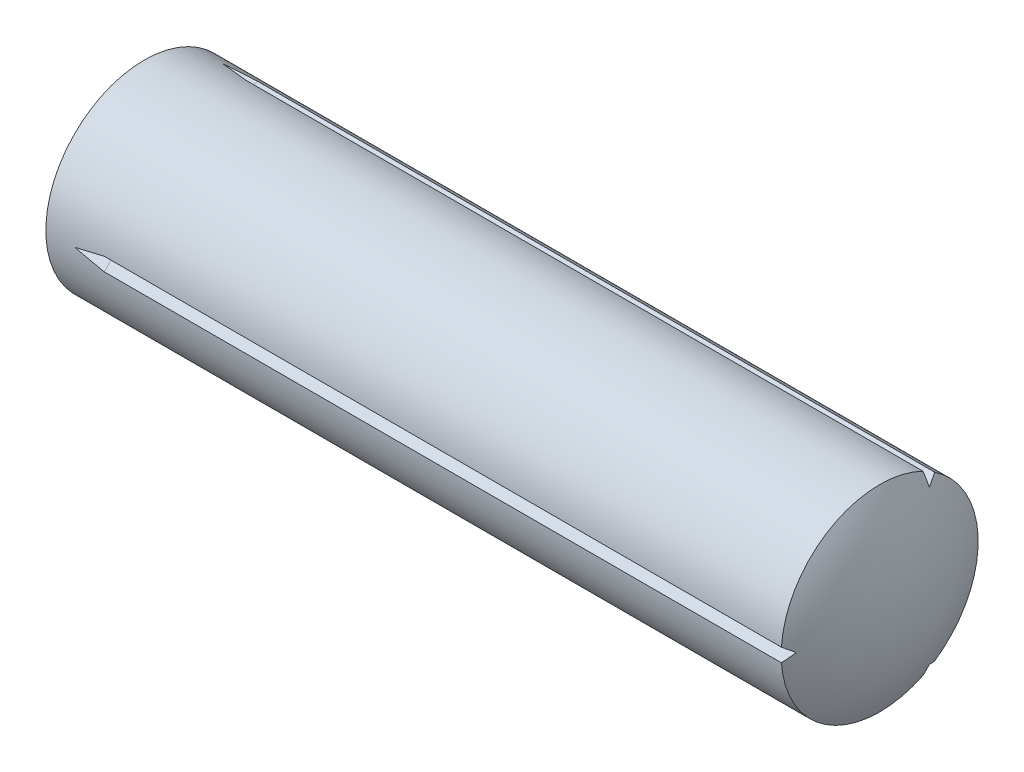
ISO-10303-21;
HEADER;
FILE_DESCRIPTION(('STEP AP214'),'2;1');
FILE_NAME('part.step','',(''),(''),'','','');
FILE_SCHEMA(('AUTOMOTIVE_DESIGN { 1 0 10303 214 1 1 1 1 }'));
ENDSEC;
DATA;
#1=APPLICATION_CONTEXT('core data for automotive mechanical design processes');
#2=APPLICATION_PROTOCOL_DEFINITION('international standard','automotive_design',2000,#1);
#3=PRODUCT_CONTEXT('',#1,'mechanical');
#4=PRODUCT('Part','Part','',(#3));
#5=PRODUCT_RELATED_PRODUCT_CATEGORY('part','',(#4));
#6=PRODUCT_DEFINITION_FORMATION('','',#4);
#7=PRODUCT_DEFINITION_CONTEXT('part definition',#1,'design');
#8=PRODUCT_DEFINITION('design','',#6,#7);
#9=PRODUCT_DEFINITION_SHAPE('','',#8);
#10=(LENGTH_UNIT() NAMED_UNIT(*) SI_UNIT(.MILLI.,.METRE.));
#11=(NAMED_UNIT(*) PLANE_ANGLE_UNIT() SI_UNIT($,.RADIAN.));
#12=(NAMED_UNIT(*) SI_UNIT($,.STERADIAN.) SOLID_ANGLE_UNIT());
#13=UNCERTAINTY_MEASURE_WITH_UNIT(LENGTH_MEASURE(1.E-05),#10,'distance_accuracy_value','');
#14=(GEOMETRIC_REPRESENTATION_CONTEXT(3) GLOBAL_UNCERTAINTY_ASSIGNED_CONTEXT((#13)) GLOBAL_UNIT_ASSIGNED_CONTEXT((#10,
#11,#12)) REPRESENTATION_CONTEXT('',''));
#15=CARTESIAN_POINT('',(0.,0.,0.));
#16=DIRECTION('',(0.,0.,1.));
#17=DIRECTION('',(1.,0.,0.));
#18=AXIS2_PLACEMENT_3D('',#15,#16,#17);
#19=CARTESIAN_POINT('',(-75.0312695557023,0.,0.));
#20=DIRECTION('',(-1.,0.,0.));
#21=DIRECTION('',(0.,1.,0.));
#22=AXIS2_PLACEMENT_3D('',#19,#20,#21);
#23=SPHERICAL_SURFACE('',#22,25.);
#24=CARTESIAN_POINT('',(-100.,0.,0.));
#25=DIRECTION('',(-1.,0.,0.));
#26=DIRECTION('',(0.,0.,1.));
#27=AXIS2_PLACEMENT_3D('',#24,#25,#26);
#28=CIRCLE('',#27,1.25);
#29=CARTESIAN_POINT('',(-100.,1.2500000000002,0.));
#30=VERTEX_POINT('',#29);
#31=EDGE_CURVE('E181',#30,#30,#28,.T.);
#32=CARTESIAN_POINT('',(-96.6819046503132,0.,0.));
#33=DIRECTION('',(-1.,0.,0.));
#34=DIRECTION('',(0.,0.,1.));
#35=AXIS2_PLACEMENT_3D('',#32,#33,#34);
#36=CIRCLE('',#35,12.5);
#37=CARTESIAN_POINT('',(-96.6819046503132,12.5,0.));
#38=VERTEX_POINT('',#37);
#39=EDGE_CURVE('E174',#38,#38,#36,.T.);
#40=CARTESIAN_POINT('',(-100.,1.2500000000002,0.));
#41=CARTESIAN_POINT('',(-99.9938336924778,1.37317333168658,0.));
#42=CARTESIAN_POINT('',(-99.9867558041352,1.49630102540896,0.));
#43=CARTESIAN_POINT('',(-99.9707787305738,1.74243819046354,0.));
#44=CARTESIAN_POINT('',(-99.9618795453548,1.86544766179574,0.));
#45=CARTESIAN_POINT('',(-99.942261742805,2.11132143560776,0.));
#46=CARTESIAN_POINT('',(-99.931543125474,2.23418573808758,0.));
#47=CARTESIAN_POINT('',(-99.9082888288313,2.47974226646478,0.));
#48=CARTESIAN_POINT('',(-99.8957531495195,2.60243449236216,0.));
#49=CARTESIAN_POINT('',(-99.8688674683718,2.84761999567285,0.));
#50=CARTESIAN_POINT('',(-99.854517466536,2.97011327308617,0.));
#51=CARTESIAN_POINT('',(-99.8240062848361,3.21487405159807,0.));
#52=CARTESIAN_POINT('',(-99.8078451049719,3.33714155269666,0.));
#53=CARTESIAN_POINT('',(-99.7737151063308,3.58142400006346,0.));
#54=CARTESIAN_POINT('',(-99.7557462875539,3.70343894633168,0.));
#55=CARTESIAN_POINT('',(-99.718004946655,3.94718956087136,0.));
#56=CARTESIAN_POINT('',(-99.698232424533,4.06892522914281,0.));
#57=CARTESIAN_POINT('',(-99.6568880074031,4.31209062567917,0.));
#58=CARTESIAN_POINT('',(-99.6353161123952,4.43352035394408,0.));
#59=CARTESIAN_POINT('',(-99.5903776740829,4.6760472754658,0.));
#60=CARTESIAN_POINT('',(-99.5670111307785,4.7971444687226,0.));
#61=CARTESIAN_POINT('',(-99.5184885135079,5.03897979805619,0.));
#62=CARTESIAN_POINT('',(-99.4933324395417,5.15971793413298,0.));
#63=CARTESIAN_POINT('',(-99.4412362705202,5.40080870557392,0.));
#64=CARTESIAN_POINT('',(-99.414296175465,5.52116134093807,0.));
#65=CARTESIAN_POINT('',(-99.3586378645657,5.76145475185175,0.));
#66=CARTESIAN_POINT('',(-99.3299196487216,5.88139552740127,0.));
#67=CARTESIAN_POINT('',(-99.2707113859815,6.12083894978741,0.));
#68=CARTESIAN_POINT('',(-99.2402213390854,6.24034159662403,0.));
#69=CARTESIAN_POINT('',(-99.1774760920364,6.47888258864311,0.));
#70=CARTESIAN_POINT('',(-99.1452208918834,6.59792093382557,0.));
#71=CARTESIAN_POINT('',(-99.078952402712,6.83550725128436,0.));
#72=CARTESIAN_POINT('',(-99.0449391136935,6.95405522356069,0.));
#73=CARTESIAN_POINT('',(-98.9751618962311,7.19063483135457,0.));
#74=CARTESIAN_POINT('',(-98.9393979677873,7.30866646687211,0.));
#75=CARTESIAN_POINT('',(-98.8661273043316,7.54418755038154,0.));
#76=CARTESIAN_POINT('',(-98.8286205693198,7.66167699837343,0.));
#77=CARTESIAN_POINT('',(-98.7518725072875,7.8960879748122,0.));
#78=CARTESIAN_POINT('',(-98.712631180267,8.01300950325909,0.));
#79=CARTESIAN_POINT('',(-98.6324225286792,8.24625903297173,0.));
#80=CARTESIAN_POINT('',(-98.5914552041119,8.36258703423749,0.));
#81=CARTESIAN_POINT('',(-98.5078035299129,8.59462403194343,0.));
#82=CARTESIAN_POINT('',(-98.4651191802811,8.71033302838361,0.));
#83=CARTESIAN_POINT('',(-98.3780428044906,8.94110667436576,0.));
#84=CARTESIAN_POINT('',(-98.3336507783319,9.05617132390772,0.));
#85=CARTESIAN_POINT('',(-98.2431687720324,9.28563107514242,0.));
#86=CARTESIAN_POINT('',(-98.1970787918916,9.40002617683515,0.));
#87=CARTESIAN_POINT('',(-98.1032109720534,9.62812177806317,0.));
#88=CARTESIAN_POINT('',(-98.055433132356,9.74182227759846,0.));
#89=CARTESIAN_POINT('',(-97.9582000574885,9.96850377232688,0.));
#90=CARTESIAN_POINT('',(-97.9087448223184,10.08148476752,0.));
#91=CARTESIAN_POINT('',(-97.8081677879997,10.3067025089814,0.));
#92=CARTESIAN_POINT('',(-97.7570459888512,10.4189392552497,0.));
#93=CARTESIAN_POINT('',(-97.6531470229441,10.6426439172087,0.));
#94=CARTESIAN_POINT('',(-97.6003698561855,10.7541118328994,0.));
#95=CARTESIAN_POINT('',(-97.4931717144603,10.9762544207054,0.));
#96=CARTESIAN_POINT('',(-97.4387507394937,11.0869290928207,0.));
#97=CARTESIAN_POINT('',(-97.3282768989746,11.307460953207,0.));
#98=CARTESIAN_POINT('',(-97.272224033422,11.417318141478,0.));
#99=CARTESIAN_POINT('',(-97.1584986934783,11.6361909766945,0.));
#100=CARTESIAN_POINT('',(-97.1008262190871,11.7452066236399,0.));
#101=CARTESIAN_POINT('',(-96.9838742728691,11.9623724890545,0.));
#102=CARTESIAN_POINT('',(-96.9245948010422,12.0705227075237,0.));
#103=CARTESIAN_POINT('',(-96.8044419168537,12.2859340705523,0.));
#104=CARTESIAN_POINT('',(-96.743568504492,12.3931952151119,0.));
#105=CARTESIAN_POINT('',(-96.6819046503132,12.5,0.));
#106=B_SPLINE_CURVE_WITH_KNOTS('',3,(#40,#41,#42,#43,#44,#45,#46,#47,#48,#49,#50,#51,#52,#53,
#54,#55,#56,#57,#58,#59,#60,#61,#62,#63,#64,#65,#66,#67,#68,#69,#70,#71,#72,#73,#74,#75,#76,#77,
#78,#79,#80,#81,#82,#83,#84,#85,#86,#87,#88,#89,#90,#91,#92,#93,#94,#95,#96,#97,#98,#99,#100,
#101,#102,#103,#104,#105),.UNSPECIFIED.,.F.,.F.,(4,2,2,2,2,2,2,2,2,2,2,2,2,2,2,2,2,2,2,2,2,2,2,
2,2,2,2,2,2,2,2,2,4),(0.,0.369979372671543,0.739958745343087,1.10993811801463,1.47991749068617,
1.84989686335772,2.21987623602926,2.5898556087008,2.95983498137235,3.32981435404389,
3.69979372671543,4.06977309938697,4.43975247205852,4.80973184473006,5.17971121740161,
5.54969059007315,5.91966996274469,6.28964933541624,6.65962870808778,7.02960808075932,
7.39958745343087,7.76956682610241,8.13954619877395,8.5095255714455,8.87950494411704,
9.24948431678859,9.61946368946012,9.98944306213167,10.3594224348032,10.7294018074747,
11.0993811801463,11.4693605528178,11.8393399254894),.UNSPECIFIED.);
#107=EDGE_CURVE('BSEAM35',#30,#38,#106,.T.);
#108=ORIENTED_EDGE('',*,*,#31,.F.);
#109=ORIENTED_EDGE('',*,*,#39,.T.);
#110=ORIENTED_EDGE('',*,*,#107,.T.);
#111=ORIENTED_EDGE('',*,*,#107,.F.);
#112=EDGE_LOOP('',(#108,#110,#109,#111));
#113=FACE_BOUND('',#112,.T.);
#114=ADVANCED_FACE('F35',(#113),#23,.T.);
#115=CARTESIAN_POINT('',(-100.,0.,0.));
#116=DIRECTION('',(1.,0.,0.));
#117=DIRECTION('',(0.,0.,-1.));
#118=AXIS2_PLACEMENT_3D('',#115,#116,#117);
#119=PLANE('',#118);
#120=ORIENTED_EDGE('',*,*,#31,.T.);
#121=EDGE_LOOP('',(#120));
#122=FACE_BOUND('',#121,.T.);
#123=ADVANCED_FACE('F240',(#122),#119,.F.);
#124=CARTESIAN_POINT('',(-25.,0.,0.));
#125=DIRECTION('',(-1.,0.,0.));
#126=DIRECTION('',(0.,1.,0.));
#127=AXIS2_PLACEMENT_3D('',#124,#125,#126);
#128=SPHERICAL_SURFACE('',#127,25.);
#129=CARTESIAN_POINT('',(-25.,5.84816389566394,2.72704361069372));
#130=DIRECTION('',(0.,-0.906307787036646,-0.422618261740707));
#131=DIRECTION('',(0.,0.422618261740707,-0.906307787036647));
#132=AXIS2_PLACEMENT_3D('',#129,#130,#131);
#133=CIRCLE('',#132,24.1528924188145);
#134=CARTESIAN_POINT('',(-3.34936490538902,10.372592162154,-6.97562411814315));
#135=VERTEX_POINT('',#134);
#136=CARTESIAN_POINT('',(-2.67428612563531,9.74278579257499,-5.62499999999991));
#137=VERTEX_POINT('',#136);
#138=EDGE_CURVE('E49',#135,#137,#133,.T.);
#139=ORIENTED_EDGE('',*,*,#138,.T.);
#140=CARTESIAN_POINT('',(-25.,0.562392903743302,-6.42818030448681));
#141=DIRECTION('',(0.,-0.0871557427476711,0.996194698091744));
#142=DIRECTION('',(0.,-0.996194698091745,-0.0871557427476711));
#143=AXIS2_PLACEMENT_3D('',#140,#141,#142);
#144=CIRCLE('',#143,24.1528924188145);
#145=CARTESIAN_POINT('',(-3.34936490538902,11.2273637746405,-5.49511625644897));
#146=VERTEX_POINT('',#145);
#147=EDGE_CURVE('E138',#137,#146,#144,.T.);
#148=ORIENTED_EDGE('',*,*,#147,.T.);
#149=CARTESIAN_POINT('',(-3.34936490538902,0.,0.));
#150=DIRECTION('',(-1.,0.,0.));
#151=DIRECTION('',(0.,0.,1.));
#152=AXIS2_PLACEMENT_3D('',#149,#150,#151);
#153=CIRCLE('',#152,12.5);
#154=CARTESIAN_POINT('',(-3.34936490538902,0.854771612486484,12.4707403745923));
#155=VERTEX_POINT('',#154);
#156=EDGE_CURVE('E178',#155,#146,#153,.T.);
#157=ORIENTED_EDGE('',*,*,#156,.F.);
#158=CARTESIAN_POINT('',(-25.,-5.28577099192074,3.70113669379313));
#159=DIRECTION('',(0.,0.819152044288991,-0.573576436351047));
#160=DIRECTION('',(0.,0.573576436351047,0.819152044288991));
#161=AXIS2_PLACEMENT_3D('',#158,#159,#160);
#162=CIRCLE('',#161,24.1528924188145);
#163=CARTESIAN_POINT('',(-2.67428612563531,0.,11.25));
#164=VERTEX_POINT('',#163);
#165=EDGE_CURVE('E168',#155,#164,#162,.T.);
#166=ORIENTED_EDGE('',*,*,#165,.T.);
#167=CARTESIAN_POINT('',(-25.,5.28577099192075,3.70113669379315));
#168=DIRECTION('',(0.,-0.81915204428899,-0.573576436351049));
#169=DIRECTION('',(0.,0.573576436351049,-0.81915204428899));
#170=AXIS2_PLACEMENT_3D('',#167,#168,#169);
#171=CIRCLE('',#170,24.1528924188145);
#172=CARTESIAN_POINT('',(-3.34936490538902,-0.854771612486489,12.4707403745923));
#173=VERTEX_POINT('',#172);
#174=EDGE_CURVE('E171',#164,#173,#171,.T.);
#175=ORIENTED_EDGE('',*,*,#174,.T.);
#176=CARTESIAN_POINT('',(-3.34936490538902,-11.2273637746404,-5.49511625644914));
#177=VERTEX_POINT('',#176);
#178=EDGE_CURVE('E177',#177,#173,#153,.T.);
#179=ORIENTED_EDGE('',*,*,#178,.F.);
#180=CARTESIAN_POINT('',(-25.,-0.562392903743194,-6.4281803044868));
#181=DIRECTION('',(0.,0.0871557427476546,0.996194698091746));
#182=DIRECTION('',(0.,-0.996194698091746,0.0871557427476546));
#183=AXIS2_PLACEMENT_3D('',#180,#181,#182);
#184=CIRCLE('',#183,24.1528924188145);
#185=CARTESIAN_POINT('',(-2.67428612563531,-9.74278579257491,-5.62500000000005));
#186=VERTEX_POINT('',#185);
#187=EDGE_CURVE('E57',#177,#186,#184,.T.);
#188=ORIENTED_EDGE('',*,*,#187,.T.);
#189=CARTESIAN_POINT('',(-25.,-5.84816389566401,2.72704361069364));
#190=DIRECTION('',(0.,0.906307787036653,-0.422618261740692));
#191=DIRECTION('',(0.,0.422618261740692,0.906307787036653));
#192=AXIS2_PLACEMENT_3D('',#189,#190,#191);
#193=CIRCLE('',#192,24.1528924188145);
#194=CARTESIAN_POINT('',(-3.34936490538902,-10.3725921621539,-6.9756241181433));
#195=VERTEX_POINT('',#194);
#196=EDGE_CURVE('E154',#186,#195,#193,.T.);
#197=ORIENTED_EDGE('',*,*,#196,.T.);
#198=EDGE_CURVE('E182',#135,#195,#153,.T.);
#199=ORIENTED_EDGE('',*,*,#198,.F.);
#200=EDGE_LOOP('',(#139,#148,#157,#166,#175,#179,#188,#197,#199));
#201=FACE_BOUND('',#200,.T.);
#202=ADVANCED_FACE('F210',(#201),#128,.T.);
#203=CARTESIAN_POINT('',(-117.,0.,0.));
#204=DIRECTION('',(-1.,0.,0.));
#205=DIRECTION('',(0.,0.,1.));
#206=AXIS2_PLACEMENT_3D('',#203,#204,#205);
#207=CYLINDRICAL_SURFACE('',#206,12.5);
#208=ORIENTED_EDGE('',*,*,#39,.F.);
#209=EDGE_LOOP('',(#208));
#210=FACE_BOUND('',#209,.T.);
#211=ORIENTED_EDGE('',*,*,#156,.T.);
#212=DIRECTION('',(-1.,0.,0.));
#213=VECTOR('',#212,1.);
#214=CARTESIAN_POINT('',(-117.,11.2273637746405,-5.49511625644897));
#215=LINE('',#214,#213);
#216=CARTESIAN_POINT('',(-89.2885509825952,11.2273637746405,-5.49511625644897));
#217=VERTEX_POINT('',#216);
#218=EDGE_CURVE('E12',#146,#217,#215,.T.);
#219=ORIENTED_EDGE('',*,*,#218,.T.);
#220=CARTESIAN_POINT('',(-58.0000000000001,0.,0.));
#221=DIRECTION('',(0.192914632005355,0.058217099674931,-0.979486964723716));
#222=DIRECTION('',(-0.981215544494806,0.0114459360363994,-0.192574779735074));
#223=AXIS2_PLACEMENT_3D('',#220,#221,#222);
#224=ELLIPSE('',#223,64.7954998024879,12.5);
#225=CARTESIAN_POINT('',(-93.,10.8253175473055,-6.2499999999999));
#226=VERTEX_POINT('',#225);
#227=EDGE_CURVE('E42',#226,#217,#224,.T.);
#228=ORIENTED_EDGE('',*,*,#227,.F.);
#229=CARTESIAN_POINT('',(-58.0000000000001,0.,0.));
#230=DIRECTION('',(0.192914632005354,0.877369143963907,0.439325995108735));
#231=DIRECTION('',(-0.981215544494806,0.172497619396964,0.0863749184899265));
#232=AXIS2_PLACEMENT_3D('',#229,#230,#231);
#233=ELLIPSE('',#232,64.7954998024882,12.5);
#234=CARTESIAN_POINT('',(-89.2885509825952,10.372592162154,-6.97562411814315));
#235=VERTEX_POINT('',#234);
#236=EDGE_CURVE('E131',#235,#226,#233,.T.);
#237=ORIENTED_EDGE('',*,*,#236,.F.);
#238=DIRECTION('',(-1.,0.,0.));
#239=VECTOR('',#238,1.);
#240=CARTESIAN_POINT('',(-117.,10.372592162154,-6.97562411814315));
#241=LINE('',#240,#239);
#242=EDGE_CURVE('E134',#235,#135,#241,.F.);
#243=ORIENTED_EDGE('',*,*,#242,.T.);
#244=ORIENTED_EDGE('',*,*,#198,.T.);
#245=DIRECTION('',(-1.,0.,0.));
#246=VECTOR('',#245,1.);
#247=CARTESIAN_POINT('',(-117.,-10.3725921621539,-6.9756241181433));
#248=LINE('',#247,#246);
#249=CARTESIAN_POINT('',(-89.2885509825952,-10.3725921621539,-6.9756241181433));
#250=VERTEX_POINT('',#249);
#251=EDGE_CURVE('E201',#195,#250,#248,.T.);
#252=ORIENTED_EDGE('',*,*,#251,.T.);
#253=CARTESIAN_POINT('',(-58.0000000000001,0.,0.));
#254=DIRECTION('',(0.192914632005355,-0.877369143963914,0.439325995108721));
#255=DIRECTION('',(-0.981215544494806,-0.172497619396966,0.0863749184899239));
#256=AXIS2_PLACEMENT_3D('',#253,#254,#255);
#257=ELLIPSE('',#256,64.7954998024879,12.5);
#258=CARTESIAN_POINT('',(-93.,-10.8253175473055,-6.25000000000005));
#259=VERTEX_POINT('',#258);
#260=EDGE_CURVE('E199',#259,#250,#257,.T.);
#261=ORIENTED_EDGE('',*,*,#260,.F.);
#262=CARTESIAN_POINT('',(-58.0000000000001,0.,0.));
#263=DIRECTION('',(0.192914632005354,-0.0582170996749149,-0.979486964723717));
#264=DIRECTION('',(-0.981215544494806,-0.0114459360363962,-0.192574779735073));
#265=AXIS2_PLACEMENT_3D('',#262,#263,#264);
#266=ELLIPSE('',#265,64.7954998024881,12.5);
#267=CARTESIAN_POINT('',(-89.2885509825952,-11.2273637746404,-5.49511625644913));
#268=VERTEX_POINT('',#267);
#269=EDGE_CURVE('E197',#268,#259,#266,.T.);
#270=ORIENTED_EDGE('',*,*,#269,.F.);
#271=DIRECTION('',(-1.,0.,0.));
#272=VECTOR('',#271,1.);
#273=CARTESIAN_POINT('',(-117.,-11.2273637746404,-5.49511625644914));
#274=LINE('',#273,#272);
#275=EDGE_CURVE('E195',#268,#177,#274,.F.);
#276=ORIENTED_EDGE('',*,*,#275,.T.);
#277=ORIENTED_EDGE('',*,*,#178,.T.);
#278=DIRECTION('',(-1.,0.,0.));
#279=VECTOR('',#278,1.);
#280=CARTESIAN_POINT('',(-117.,-0.854771612486489,12.4707403745923));
#281=LINE('',#280,#279);
#282=CARTESIAN_POINT('',(-89.2885509825952,-0.854771612486491,12.4707403745923));
#283=VERTEX_POINT('',#282);
#284=EDGE_CURVE('E192',#173,#283,#281,.T.);
#285=ORIENTED_EDGE('',*,*,#284,.T.);
#286=CARTESIAN_POINT('',(-58.0000000000001,0.,0.));
#287=DIRECTION('',(0.192914632005355,0.81915204428899,0.540160969614991));
#288=DIRECTION('',(-0.981215544494806,0.161051683360568,0.106199861245149));
#289=AXIS2_PLACEMENT_3D('',#286,#287,#288);
#290=ELLIPSE('',#289,64.7954998024879,12.5);
#291=CARTESIAN_POINT('',(-93.,0.,12.5));
#292=VERTEX_POINT('',#291);
#293=EDGE_CURVE('E190',#292,#283,#290,.T.);
#294=ORIENTED_EDGE('',*,*,#293,.F.);
#295=CARTESIAN_POINT('',(-58.0000000000001,0.,0.));
#296=DIRECTION('',(0.192914632005354,-0.819152044288991,0.540160969614989));
#297=DIRECTION('',(-0.981215544494806,-0.161051683360567,0.106199861245148));
#298=AXIS2_PLACEMENT_3D('',#295,#296,#297);
#299=ELLIPSE('',#298,64.7954998024882,12.5);
#300=CARTESIAN_POINT('',(-89.2885509825952,0.854771612486486,12.4707403745923));
#301=VERTEX_POINT('',#300);
#302=EDGE_CURVE('E188',#301,#292,#299,.T.);
#303=ORIENTED_EDGE('',*,*,#302,.F.);
#304=DIRECTION('',(-1.,0.,0.));
#305=VECTOR('',#304,1.);
#306=CARTESIAN_POINT('',(-117.,0.854771612486484,12.4707403745923));
#307=LINE('',#306,#305);
#308=EDGE_CURVE('E185',#301,#155,#307,.F.);
#309=ORIENTED_EDGE('',*,*,#308,.T.);
#310=EDGE_LOOP('',(#211,#219,#228,#237,#243,#244,#252,#261,#270,#276,#277,#285,#294,#303,#309));
#311=FACE_BOUND('',#310,.T.);
#312=ADVANCED_FACE('F207',(#210,#311),#207,.T.);
#313=CARTESIAN_POINT('',(-89.5403135833637,0.16296555585723,11.0172610662349));
#314=DIRECTION('',(0.192914632005355,0.81915204428899,0.540160969614991));
#315=DIRECTION('',(0.,-0.550501847066744,0.834833945390401));
#316=AXIS2_PLACEMENT_3D('',#313,#314,#315);
#317=PLANE('',#316);
#318=ORIENTED_EDGE('',*,*,#293,.T.);
#319=DIRECTION('',(-0.140481336122402,0.567888466332703,-0.81102878124488));
#320=VECTOR('',#319,1.);
#321=CARTESIAN_POINT('',(-89.5403135833637,0.16296555585723,11.0172610662349));
#322=LINE('',#321,#320);
#323=CARTESIAN_POINT('',(-89.5,0.,11.25));
#324=VERTEX_POINT('',#323);
#325=EDGE_CURVE('E162',#283,#324,#322,.T.);
#326=ORIENTED_EDGE('',*,*,#325,.T.);
#327=DIRECTION('',(-0.941741911594837,0.,0.336336396998157));
#328=VECTOR('',#327,1.);
#329=CARTESIAN_POINT('',(-89.5,0.,11.25));
#330=LINE('',#329,#328);
#331=EDGE_CURVE('E161',#324,#292,#330,.T.);
#332=ORIENTED_EDGE('',*,*,#331,.T.);
#333=EDGE_LOOP('',(#318,#326,#332));
#334=FACE_BOUND('',#333,.T.);
#335=ADVANCED_FACE('F228',(#334),#317,.T.);
#336=CARTESIAN_POINT('',(-89.5403135833637,-0.162965555857229,11.0172610662349));
#337=DIRECTION('',(0.192914632005354,-0.819152044288991,0.540160969614989));
#338=DIRECTION('',(0.,-0.550501847066742,-0.834833945390403));
#339=AXIS2_PLACEMENT_3D('',#336,#337,#338);
#340=PLANE('',#339);
#341=ORIENTED_EDGE('',*,*,#302,.T.);
#342=ORIENTED_EDGE('',*,*,#331,.F.);
#343=DIRECTION('',(0.140481336122402,0.567888466332701,0.811028781244881));
#344=VECTOR('',#343,1.);
#345=CARTESIAN_POINT('',(-89.5403135833637,-0.162965555857229,11.0172610662349));
#346=LINE('',#345,#344);
#347=EDGE_CURVE('E158',#324,#301,#346,.T.);
#348=ORIENTED_EDGE('',*,*,#347,.T.);
#349=EDGE_LOOP('',(#341,#342,#348));
#350=FACE_BOUND('',#349,.T.);
#351=ADVANCED_FACE('F226',(#350),#340,.T.);
#352=CARTESIAN_POINT('',(-91.5427449464557,0.,11.25));
#353=DIRECTION('',(0.,-0.81915204428899,-0.573576436351049));
#354=DIRECTION('',(0.,0.573576436351049,-0.81915204428899));
#355=AXIS2_PLACEMENT_3D('',#352,#353,#354);
#356=PLANE('',#355);
#357=DIRECTION('',(1.,0.,0.));
#358=VECTOR('',#357,1.);
#359=CARTESIAN_POINT('',(-91.5427449464557,0.,11.25));
#360=LINE('',#359,#358);
#361=EDGE_CURVE('E157',#324,#164,#360,.T.);
#362=ORIENTED_EDGE('',*,*,#361,.F.);
#363=ORIENTED_EDGE('',*,*,#325,.F.);
#364=ORIENTED_EDGE('',*,*,#284,.F.);
#365=ORIENTED_EDGE('',*,*,#174,.F.);
#366=EDGE_LOOP('',(#362,#363,#364,#365));
#367=FACE_BOUND('',#366,.T.);
#368=ADVANCED_FACE('F218',(#367),#356,.F.);
#369=CARTESIAN_POINT('',(-91.5427449464557,0.,11.25));
#370=DIRECTION('',(0.,0.819152044288991,-0.573576436351047));
#371=DIRECTION('',(0.,0.573576436351047,0.819152044288991));
#372=AXIS2_PLACEMENT_3D('',#369,#370,#371);
#373=PLANE('',#372);
#374=ORIENTED_EDGE('',*,*,#308,.F.);
#375=ORIENTED_EDGE('',*,*,#347,.F.);
#376=ORIENTED_EDGE('',*,*,#361,.T.);
#377=ORIENTED_EDGE('',*,*,#165,.F.);
#378=EDGE_LOOP('',(#374,#375,#376,#377));
#379=FACE_BOUND('',#378,.T.);
#380=ADVANCED_FACE('F221',(#379),#373,.F.);
#381=CARTESIAN_POINT('',(-89.5390504627441,-9.62647297886181,-5.37556636604834));
#382=DIRECTION('',(0.192914632005355,-0.877369143963914,0.439325995108721));
#383=DIRECTION('',(0.,-0.447736481116302,-0.894165557085259));
#384=AXIS2_PLACEMENT_3D('',#381,#382,#383);
#385=PLANE('',#384);
#386=ORIENTED_EDGE('',*,*,#260,.T.);
#387=DIRECTION('',(-0.140481336122402,0.418427294592043,0.897320228982747));
#388=VECTOR('',#387,1.);
#389=CARTESIAN_POINT('',(-89.5390504627441,-9.62647297886181,-5.37556636604834));
#390=LINE('',#389,#388);
#391=CARTESIAN_POINT('',(-89.5,-9.74278579257492,-5.62500000000005));
#392=VERTEX_POINT('',#391);
#393=EDGE_CURVE('E148',#250,#392,#390,.T.);
#394=ORIENTED_EDGE('',*,*,#393,.T.);
#395=DIRECTION('',(-0.941741911594837,-0.291275864017732,-0.16816819849908));
#396=VECTOR('',#395,1.);
#397=CARTESIAN_POINT('',(-89.5,-9.74278579257492,-5.62500000000005));
#398=LINE('',#397,#396);
#399=EDGE_CURVE('E147',#392,#259,#398,.T.);
#400=ORIENTED_EDGE('',*,*,#399,.T.);
#401=EDGE_LOOP('',(#386,#394,#400));
#402=FACE_BOUND('',#401,.T.);
#403=ADVANCED_FACE('F266',(#402),#385,.T.);
#404=CARTESIAN_POINT('',(-89.5390504627441,-9.46861352215791,-5.6489869655147));
#405=DIRECTION('',(0.192914632005354,-0.0582170996749149,-0.979486964723717));
#406=DIRECTION('',(-0.981151049538824,0.,-0.193242381451027));
#407=AXIS2_PLACEMENT_3D('',#404,#405,#406);
#408=PLANE('',#407);
#409=ORIENTED_EDGE('',*,*,#269,.T.);
#410=ORIENTED_EDGE('',*,*,#399,.F.);
#411=DIRECTION('',(0.140481336122402,-0.98631576092475,0.0862914477378576));
#412=VECTOR('',#411,1.);
#413=CARTESIAN_POINT('',(-89.5390504627441,-9.46861352215791,-5.6489869655147));
#414=LINE('',#413,#412);
#415=EDGE_CURVE('E144',#392,#268,#414,.T.);
#416=ORIENTED_EDGE('',*,*,#415,.T.);
#417=EDGE_LOOP('',(#409,#410,#416));
#418=FACE_BOUND('',#417,.T.);
#419=ADVANCED_FACE('F271',(#418),#408,.T.);
#420=CARTESIAN_POINT('',(-91.4787408801565,-9.74278579257492,-5.62500000000005));
#421=DIRECTION('',(0.,0.906307787036653,-0.422618261740692));
#422=DIRECTION('',(0.,0.422618261740692,0.906307787036653));
#423=AXIS2_PLACEMENT_3D('',#420,#421,#422);
#424=PLANE('',#423);
#425=DIRECTION('',(1.,0.,0.));
#426=VECTOR('',#425,1.);
#427=CARTESIAN_POINT('',(-91.4787408801565,-9.74278579257492,-5.62500000000005));
#428=LINE('',#427,#426);
#429=EDGE_CURVE('E143',#392,#186,#428,.T.);
#430=ORIENTED_EDGE('',*,*,#429,.F.);
#431=ORIENTED_EDGE('',*,*,#393,.F.);
#432=ORIENTED_EDGE('',*,*,#251,.F.);
#433=ORIENTED_EDGE('',*,*,#196,.F.);
#434=EDGE_LOOP('',(#430,#431,#432,#433));
#435=FACE_BOUND('',#434,.T.);
#436=ADVANCED_FACE('F283',(#435),#424,.F.);
#437=CARTESIAN_POINT('',(-91.4787408801565,-9.74278579257492,-5.62500000000005));
#438=DIRECTION('',(0.,0.0871557427476546,0.996194698091746));
#439=DIRECTION('',(0.,-0.996194698091746,0.0871557427476546));
#440=AXIS2_PLACEMENT_3D('',#437,#438,#439);
#441=PLANE('',#440);
#442=ORIENTED_EDGE('',*,*,#275,.F.);
#443=ORIENTED_EDGE('',*,*,#415,.F.);
#444=ORIENTED_EDGE('',*,*,#429,.T.);
#445=ORIENTED_EDGE('',*,*,#187,.F.);
#446=EDGE_LOOP('',(#442,#443,#444,#445));
#447=FACE_BOUND('',#446,.T.);
#448=ADVANCED_FACE('F293',(#447),#441,.F.);
#449=CARTESIAN_POINT('',(-89.5390504627441,9.46861352215799,-5.64898696551457));
#450=DIRECTION('',(0.192914632005355,0.058217099674931,-0.979486964723716));
#451=DIRECTION('',(-0.981151049538824,0.,-0.193242381451028));
#452=AXIS2_PLACEMENT_3D('',#449,#450,#451);
#453=PLANE('',#452);
#454=ORIENTED_EDGE('',*,*,#227,.T.);
#455=DIRECTION('',(-0.140481336122402,-0.986315760924749,-0.0862914477378739));
#456=VECTOR('',#455,1.);
#457=CARTESIAN_POINT('',(-89.5390504627441,9.46861352215799,-5.64898696551457));
#458=LINE('',#457,#456);
#459=CARTESIAN_POINT('',(-89.5,9.742785792575,-5.62499999999992));
#460=VERTEX_POINT('',#459);
#461=EDGE_CURVE('E116',#217,#460,#458,.T.);
#462=ORIENTED_EDGE('',*,*,#461,.T.);
#463=DIRECTION('',(-0.941741911594837,0.291275864017734,-0.168168198499076));
#464=VECTOR('',#463,1.);
#465=CARTESIAN_POINT('',(-89.5,9.742785792575,-5.62499999999992));
#466=LINE('',#465,#464);
#467=EDGE_CURVE('E119',#460,#226,#466,.T.);
#468=ORIENTED_EDGE('',*,*,#467,.T.);
#469=EDGE_LOOP('',(#454,#462,#468));
#470=FACE_BOUND('',#469,.T.);
#471=ADVANCED_FACE('F118',(#470),#453,.T.);
#472=CARTESIAN_POINT('',(-89.5390504627441,9.62647297886188,-5.37556636604821));
#473=DIRECTION('',(0.192914632005354,0.877369143963907,0.439325995108735));
#474=DIRECTION('',(0.,-0.447736481116317,0.894165557085251));
#475=AXIS2_PLACEMENT_3D('',#472,#473,#474);
#476=PLANE('',#475);
#477=ORIENTED_EDGE('',*,*,#236,.T.);
#478=ORIENTED_EDGE('',*,*,#467,.F.);
#479=DIRECTION('',(0.140481336122402,0.418427294592057,-0.89732022898274));
#480=VECTOR('',#479,1.);
#481=CARTESIAN_POINT('',(-89.5390504627441,9.62647297886188,-5.37556636604821));
#482=LINE('',#481,#480);
#483=EDGE_CURVE('E123',#460,#235,#482,.T.);
#484=ORIENTED_EDGE('',*,*,#483,.T.);
#485=EDGE_LOOP('',(#477,#478,#484));
#486=FACE_BOUND('',#485,.T.);
#487=ADVANCED_FACE('F129',(#486),#476,.T.);
#488=CARTESIAN_POINT('',(-91.4787408801565,9.742785792575,-5.62499999999992));
#489=DIRECTION('',(0.,-0.0871557427476711,0.996194698091744));
#490=DIRECTION('',(0.,-0.996194698091745,-0.0871557427476711));
#491=AXIS2_PLACEMENT_3D('',#488,#489,#490);
#492=PLANE('',#491);
#493=DIRECTION('',(1.,0.,0.));
#494=VECTOR('',#493,1.);
#495=CARTESIAN_POINT('',(-91.4787408801565,9.742785792575,-5.62499999999992));
#496=LINE('',#495,#494);
#497=EDGE_CURVE('E124',#460,#137,#496,.T.);
#498=ORIENTED_EDGE('',*,*,#497,.F.);
#499=ORIENTED_EDGE('',*,*,#461,.F.);
#500=ORIENTED_EDGE('',*,*,#218,.F.);
#501=ORIENTED_EDGE('',*,*,#147,.F.);
#502=EDGE_LOOP('',(#498,#499,#500,#501));
#503=FACE_BOUND('',#502,.T.);
#504=ADVANCED_FACE('F136',(#503),#492,.F.);
#505=CARTESIAN_POINT('',(-91.4787408801565,9.742785792575,-5.62499999999992));
#506=DIRECTION('',(0.,-0.906307787036646,-0.422618261740707));
#507=DIRECTION('',(0.,0.422618261740707,-0.906307787036647));
#508=AXIS2_PLACEMENT_3D('',#505,#506,#507);
#509=PLANE('',#508);
#510=ORIENTED_EDGE('',*,*,#242,.F.);
#511=ORIENTED_EDGE('',*,*,#483,.F.);
#512=ORIENTED_EDGE('',*,*,#497,.T.);
#513=ORIENTED_EDGE('',*,*,#138,.F.);
#514=EDGE_LOOP('',(#510,#511,#512,#513));
#515=FACE_BOUND('',#514,.T.);
#516=ADVANCED_FACE('F133',(#515),#509,.F.);
#517=CLOSED_SHELL('',(#114,#123,#202,#312,#335,#351,#368,#380,#403,#419,#436,#448,#471,#487,
#504,#516));
#518=MANIFOLD_SOLID_BREP('B2',#517);
#519=ADVANCED_BREP_SHAPE_REPRESENTATION('',(#18,#518),#14);
#520=SHAPE_DEFINITION_REPRESENTATION(#9,#519);
ENDSEC;
END-ISO-10303-21;
